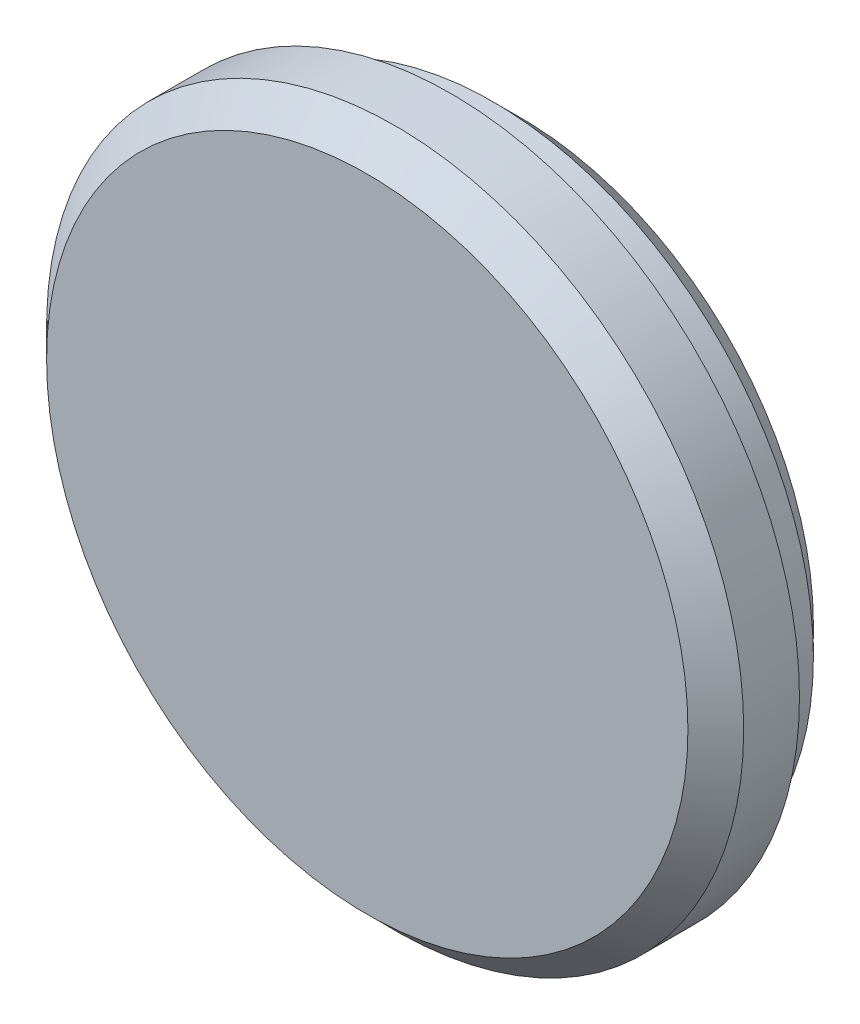
ISO-10303-21;
HEADER;
FILE_DESCRIPTION(('STEP AP214'),'2;1');
FILE_NAME('part.step','',(''),(''),'','','');
FILE_SCHEMA(('AUTOMOTIVE_DESIGN { 1 0 10303 214 1 1 1 1 }'));
ENDSEC;
DATA;
#1=APPLICATION_CONTEXT('core data for automotive mechanical design processes');
#2=APPLICATION_PROTOCOL_DEFINITION('international standard','automotive_design',2000,#1);
#3=PRODUCT_CONTEXT('',#1,'mechanical');
#4=PRODUCT('Part','Part','',(#3));
#5=PRODUCT_RELATED_PRODUCT_CATEGORY('part','',(#4));
#6=PRODUCT_DEFINITION_FORMATION('','',#4);
#7=PRODUCT_DEFINITION_CONTEXT('part definition',#1,'design');
#8=PRODUCT_DEFINITION('design','',#6,#7);
#9=PRODUCT_DEFINITION_SHAPE('','',#8);
#10=(LENGTH_UNIT() NAMED_UNIT(*) SI_UNIT(.MILLI.,.METRE.));
#11=(NAMED_UNIT(*) PLANE_ANGLE_UNIT() SI_UNIT($,.RADIAN.));
#12=(NAMED_UNIT(*) SI_UNIT($,.STERADIAN.) SOLID_ANGLE_UNIT());
#13=UNCERTAINTY_MEASURE_WITH_UNIT(LENGTH_MEASURE(1.E-05),#10,'distance_accuracy_value','');
#14=(GEOMETRIC_REPRESENTATION_CONTEXT(3) GLOBAL_UNCERTAINTY_ASSIGNED_CONTEXT((#13)) GLOBAL_UNIT_ASSIGNED_CONTEXT((#10,
#11,#12)) REPRESENTATION_CONTEXT('',''));
#15=CARTESIAN_POINT('',(0.,0.,0.));
#16=DIRECTION('',(0.,0.,1.));
#17=DIRECTION('',(1.,0.,0.));
#18=AXIS2_PLACEMENT_3D('',#15,#16,#17);
#19=CARTESIAN_POINT('',(0.,0.,-3.));
#20=DIRECTION('',(0.,0.,1.));
#21=DIRECTION('',(1.,0.,0.));
#22=AXIS2_PLACEMENT_3D('',#19,#20,#21);
#23=CYLINDRICAL_SURFACE('',#22,12.5);
#24=CARTESIAN_POINT('',(0.,0.,-1.00000000000001));
#25=DIRECTION('',(0.,0.,1.));
#26=DIRECTION('',(1.,0.,0.));
#27=AXIS2_PLACEMENT_3D('',#24,#25,#26);
#28=CIRCLE('',#27,12.5);
#29=CARTESIAN_POINT('',(12.5,0.,-1.00000000000001));
#30=VERTEX_POINT('',#29);
#31=EDGE_CURVE('E10',#30,#30,#28,.F.);
#32=ORIENTED_EDGE('',*,*,#31,.T.);
#33=EDGE_LOOP('',(#32));
#34=FACE_BOUND('',#33,.T.);
#35=CARTESIAN_POINT('',(0.,0.,-3.));
#36=DIRECTION('',(0.,0.,1.));
#37=DIRECTION('',(1.,0.,0.));
#38=AXIS2_PLACEMENT_3D('',#35,#36,#37);
#39=CIRCLE('',#38,12.5);
#40=CARTESIAN_POINT('',(12.5,0.,-3.));
#41=VERTEX_POINT('',#40);
#42=EDGE_CURVE('E76',#41,#41,#39,.T.);
#43=ORIENTED_EDGE('',*,*,#42,.T.);
#44=EDGE_LOOP('',(#43));
#45=FACE_BOUND('',#44,.T.);
#46=ADVANCED_FACE('F39',(#34,#45),#23,.T.);
#47=CARTESIAN_POINT('',(0.,0.,-3.));
#48=DIRECTION('',(0.,0.,1.));
#49=DIRECTION('',(1.,0.,0.));
#50=AXIS2_PLACEMENT_3D('',#47,#48,#49);
#51=PLANE('',#50);
#52=CARTESIAN_POINT('',(0.,0.,-3.));
#53=DIRECTION('',(0.,0.,1.));
#54=DIRECTION('',(1.,0.,0.));
#55=AXIS2_PLACEMENT_3D('',#52,#53,#54);
#56=CIRCLE('',#55,11.5);
#57=CARTESIAN_POINT('',(11.5,0.,-3.));
#58=VERTEX_POINT('',#57);
#59=EDGE_CURVE('E72',#58,#58,#56,.F.);
#60=ORIENTED_EDGE('',*,*,#59,.F.);
#61=EDGE_LOOP('',(#60));
#62=FACE_BOUND('',#61,.T.);
#63=ORIENTED_EDGE('',*,*,#42,.F.);
#64=EDGE_LOOP('',(#63));
#65=FACE_BOUND('',#64,.T.);
#66=ADVANCED_FACE('F98',(#62,#65),#51,.F.);
#67=CARTESIAN_POINT('',(0.,0.,0.));
#68=DIRECTION('',(0.,0.,1.));
#69=DIRECTION('',(1.,0.,0.));
#70=AXIS2_PLACEMENT_3D('',#67,#68,#69);
#71=PLANE('',#70);
#72=CARTESIAN_POINT('',(0.,0.,0.));
#73=DIRECTION('',(0.,0.,1.));
#74=DIRECTION('',(1.,0.,0.));
#75=AXIS2_PLACEMENT_3D('',#72,#73,#74);
#76=CIRCLE('',#75,11.5);
#77=CARTESIAN_POINT('',(11.5,0.,0.));
#78=VERTEX_POINT('',#77);
#79=EDGE_CURVE('E48',#78,#78,#76,.T.);
#80=ORIENTED_EDGE('',*,*,#79,.T.);
#81=EDGE_LOOP('',(#80));
#82=FACE_BOUND('',#81,.T.);
#83=ADVANCED_FACE('F108',(#82),#71,.T.);
#84=CARTESIAN_POINT('',(0.,0.,-5.5));
#85=DIRECTION('',(0.,0.,-1.));
#86=DIRECTION('',(-1.,0.,0.));
#87=AXIS2_PLACEMENT_3D('',#84,#85,#86);
#88=PLANE('',#87);
#89=CARTESIAN_POINT('',(0.,0.,-5.5));
#90=DIRECTION('',(0.,0.,-1.));
#91=DIRECTION('',(-1.,0.,0.));
#92=AXIS2_PLACEMENT_3D('',#89,#90,#91);
#93=CIRCLE('',#92,10.5);
#94=CARTESIAN_POINT('',(-10.5,0.,-5.5));
#95=VERTEX_POINT('',#94);
#96=EDGE_CURVE('E64',#95,#95,#93,.T.);
#97=ORIENTED_EDGE('',*,*,#96,.T.);
#98=EDGE_LOOP('',(#97));
#99=FACE_BOUND('',#98,.T.);
#100=CARTESIAN_POINT('',(0.,0.,-5.5));
#101=DIRECTION('',(0.,0.,-1.));
#102=DIRECTION('',(-1.,0.,0.));
#103=AXIS2_PLACEMENT_3D('',#100,#101,#102);
#104=CIRCLE('',#103,9.49999999999999);
#105=CARTESIAN_POINT('',(-9.49999999999999,0.,-5.5));
#106=VERTEX_POINT('',#105);
#107=EDGE_CURVE('E68',#106,#106,#104,.F.);
#108=ORIENTED_EDGE('',*,*,#107,.T.);
#109=EDGE_LOOP('',(#108));
#110=FACE_BOUND('',#109,.T.);
#111=ADVANCED_FACE('F99',(#99,#110),#88,.T.);
#112=CARTESIAN_POINT('',(0.,0.,-5.5));
#113=DIRECTION('',(0.,0.,1.));
#114=DIRECTION('',(1.,0.,0.));
#115=AXIS2_PLACEMENT_3D('',#112,#113,#114);
#116=CYLINDRICAL_SURFACE('',#115,11.5);
#117=CARTESIAN_POINT('',(0.,0.,-4.5));
#118=DIRECTION('',(0.,0.,-1.));
#119=DIRECTION('',(-1.,0.,0.));
#120=AXIS2_PLACEMENT_3D('',#117,#118,#119);
#121=CIRCLE('',#120,11.5);
#122=CARTESIAN_POINT('',(-11.5,0.,-4.5));
#123=VERTEX_POINT('',#122);
#124=EDGE_CURVE('E58',#123,#123,#121,.F.);
#125=ORIENTED_EDGE('',*,*,#124,.T.);
#126=EDGE_LOOP('',(#125));
#127=FACE_BOUND('',#126,.T.);
#128=ORIENTED_EDGE('',*,*,#59,.T.);
#129=EDGE_LOOP('',(#128));
#130=FACE_BOUND('',#129,.T.);
#131=ADVANCED_FACE('F89',(#127,#130),#116,.T.);
#132=CARTESIAN_POINT('',(0.,0.,-5.5));
#133=DIRECTION('',(0.,0.,1.));
#134=DIRECTION('',(1.,0.,0.));
#135=AXIS2_PLACEMENT_3D('',#132,#133,#134);
#136=CYLINDRICAL_SURFACE('',#135,8.5);
#137=CARTESIAN_POINT('',(0.,0.,-4.50000000000001));
#138=DIRECTION('',(0.,0.,-1.));
#139=DIRECTION('',(-1.,0.,0.));
#140=AXIS2_PLACEMENT_3D('',#137,#138,#139);
#141=CIRCLE('',#140,8.5);
#142=CARTESIAN_POINT('',(-8.5,0.,-4.50000000000001));
#143=VERTEX_POINT('',#142);
#144=EDGE_CURVE('E53',#143,#143,#141,.T.);
#145=ORIENTED_EDGE('',*,*,#144,.T.);
#146=EDGE_LOOP('',(#145));
#147=FACE_BOUND('',#146,.T.);
#148=CARTESIAN_POINT('',(0.,0.,-3.));
#149=DIRECTION('',(0.,0.,-1.));
#150=DIRECTION('',(-1.,0.,0.));
#151=AXIS2_PLACEMENT_3D('',#148,#149,#150);
#152=CIRCLE('',#151,8.5);
#153=CARTESIAN_POINT('',(-8.5,0.,-3.));
#154=VERTEX_POINT('',#153);
#155=EDGE_CURVE('E80',#154,#154,#152,.T.);
#156=ORIENTED_EDGE('',*,*,#155,.F.);
#157=EDGE_LOOP('',(#156));
#158=FACE_BOUND('',#157,.T.);
#159=ADVANCED_FACE('F87',(#147,#158),#136,.F.);
#160=ORIENTED_EDGE('',*,*,#155,.T.);
#161=EDGE_LOOP('',(#160));
#162=FACE_BOUND('',#161,.T.);
#163=ADVANCED_FACE('F85',(#162),#51,.F.);
#164=CARTESIAN_POINT('',(0.,0.,-5.5));
#165=DIRECTION('',(0.,0.,1.));
#166=DIRECTION('',(1.,0.,0.));
#167=AXIS2_PLACEMENT_3D('',#164,#165,#166);
#168=CONICAL_SURFACE('',#167,10.5,0.785398163397448);
#169=ORIENTED_EDGE('',*,*,#124,.F.);
#170=EDGE_LOOP('',(#169));
#171=FACE_BOUND('',#170,.T.);
#172=ORIENTED_EDGE('',*,*,#96,.F.);
#173=EDGE_LOOP('',(#172));
#174=FACE_BOUND('',#173,.T.);
#175=ADVANCED_FACE('F96',(#171,#174),#168,.T.);
#176=CARTESIAN_POINT('',(0.,0.,-4.50000000000001));
#177=DIRECTION('',(0.,0.,-1.));
#178=DIRECTION('',(-1.,0.,0.));
#179=AXIS2_PLACEMENT_3D('',#176,#177,#178);
#180=CONICAL_SURFACE('',#179,8.5,0.785398163397449);
#181=ORIENTED_EDGE('',*,*,#107,.F.);
#182=EDGE_LOOP('',(#181));
#183=FACE_BOUND('',#182,.T.);
#184=ORIENTED_EDGE('',*,*,#144,.F.);
#185=EDGE_LOOP('',(#184));
#186=FACE_BOUND('',#185,.T.);
#187=ADVANCED_FACE('F118',(#183,#186),#180,.F.);
#188=CARTESIAN_POINT('',(0.,0.,0.));
#189=DIRECTION('',(0.,0.,-1.));
#190=DIRECTION('',(-1.,0.,0.));
#191=AXIS2_PLACEMENT_3D('',#188,#189,#190);
#192=CONICAL_SURFACE('',#191,11.5,0.785398163397442);
#193=ORIENTED_EDGE('',*,*,#31,.F.);
#194=EDGE_LOOP('',(#193));
#195=FACE_BOUND('',#194,.T.);
#196=ORIENTED_EDGE('',*,*,#79,.F.);
#197=EDGE_LOOP('',(#196));
#198=FACE_BOUND('',#197,.T.);
#199=ADVANCED_FACE('F42',(#195,#198),#192,.T.);
#200=CLOSED_SHELL('',(#46,#66,#83,#111,#131,#159,#163,#175,#187,#199));
#201=MANIFOLD_SOLID_BREP('B2',#200);
#202=ADVANCED_BREP_SHAPE_REPRESENTATION('',(#18,#201),#14);
#203=SHAPE_DEFINITION_REPRESENTATION(#9,#202);
ENDSEC;
END-ISO-10303-21;
